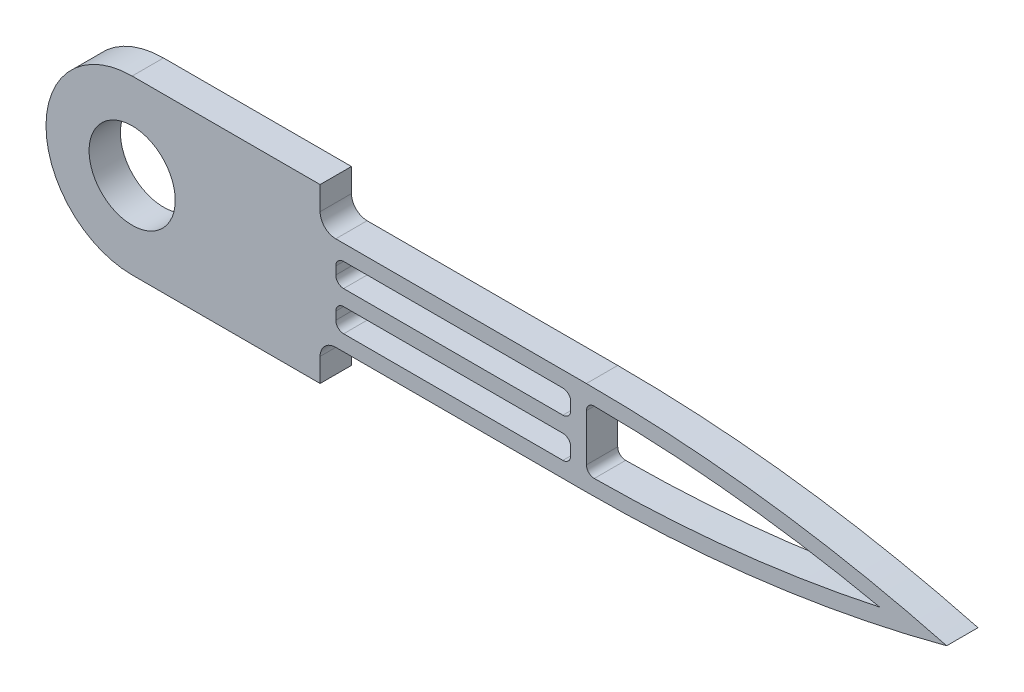
ISO-10303-21;
HEADER;
FILE_DESCRIPTION(('STEP AP214'),'2;1');
FILE_NAME('part.step','',(''),(''),'','','');
FILE_SCHEMA(('AUTOMOTIVE_DESIGN { 1 0 10303 214 1 1 1 1 }'));
ENDSEC;
DATA;
#1=APPLICATION_CONTEXT('core data for automotive mechanical design processes');
#2=APPLICATION_PROTOCOL_DEFINITION('international standard','automotive_design',2000,#1);
#3=PRODUCT_CONTEXT('',#1,'mechanical');
#4=PRODUCT('Part','Part','',(#3));
#5=PRODUCT_RELATED_PRODUCT_CATEGORY('part','',(#4));
#6=PRODUCT_DEFINITION_FORMATION('','',#4);
#7=PRODUCT_DEFINITION_CONTEXT('part definition',#1,'design');
#8=PRODUCT_DEFINITION('design','',#6,#7);
#9=PRODUCT_DEFINITION_SHAPE('','',#8);
#10=(LENGTH_UNIT() NAMED_UNIT(*) SI_UNIT(.MILLI.,.METRE.));
#11=(NAMED_UNIT(*) PLANE_ANGLE_UNIT() SI_UNIT($,.RADIAN.));
#12=(NAMED_UNIT(*) SI_UNIT($,.STERADIAN.) SOLID_ANGLE_UNIT());
#13=UNCERTAINTY_MEASURE_WITH_UNIT(LENGTH_MEASURE(1.E-05),#10,'distance_accuracy_value','');
#14=(GEOMETRIC_REPRESENTATION_CONTEXT(3) GLOBAL_UNCERTAINTY_ASSIGNED_CONTEXT((#13)) GLOBAL_UNIT_ASSIGNED_CONTEXT((#10,
#11,#12)) REPRESENTATION_CONTEXT('',''));
#15=CARTESIAN_POINT('',(0.,0.,0.));
#16=DIRECTION('',(0.,0.,1.));
#17=DIRECTION('',(1.,0.,0.));
#18=AXIS2_PLACEMENT_3D('',#15,#16,#17);
#19=CARTESIAN_POINT('',(73.66,220.133333333333,5.08));
#20=DIRECTION('',(0.,0.,-1.));
#21=DIRECTION('',(-1.,0.,0.));
#22=AXIS2_PLACEMENT_3D('',#19,#20,#21);
#23=CYLINDRICAL_SURFACE('',#22,227.753333333333);
#24=CARTESIAN_POINT('',(73.66,220.133333333333,0.));
#25=DIRECTION('',(0.,0.,1.));
#26=DIRECTION('',(1.,0.,0.));
#27=AXIS2_PLACEMENT_3D('',#24,#25,#26);
#28=CIRCLE('',#27,227.753333333333);
#29=CARTESIAN_POINT('',(73.66,-7.62,0.));
#30=VERTEX_POINT('',#29);
#31=CARTESIAN_POINT('',(132.08,0.,0.));
#32=VERTEX_POINT('',#31);
#33=EDGE_CURVE('E308',#30,#32,#28,.T.);
#34=ORIENTED_EDGE('',*,*,#33,.T.);
#35=DIRECTION('',(0.,0.,-1.));
#36=VECTOR('',#35,1.);
#37=CARTESIAN_POINT('',(132.08,0.,5.08));
#38=LINE('',#37,#36);
#39=CARTESIAN_POINT('',(132.08,0.,5.08));
#40=VERTEX_POINT('',#39);
#41=EDGE_CURVE('E370',#40,#32,#38,.T.);
#42=ORIENTED_EDGE('',*,*,#41,.F.);
#43=CARTESIAN_POINT('',(73.66,220.133333333333,5.08));
#44=DIRECTION('',(0.,0.,1.));
#45=DIRECTION('',(1.,0.,0.));
#46=AXIS2_PLACEMENT_3D('',#43,#44,#45);
#47=CIRCLE('',#46,227.753333333333);
#48=CARTESIAN_POINT('',(73.66,-7.62,5.08));
#49=VERTEX_POINT('',#48);
#50=EDGE_CURVE('E311',#49,#40,#47,.T.);
#51=ORIENTED_EDGE('',*,*,#50,.F.);
#52=DIRECTION('',(0.,0.,-1.));
#53=VECTOR('',#52,1.);
#54=CARTESIAN_POINT('',(73.66,-7.62,5.08));
#55=LINE('',#54,#53);
#56=EDGE_CURVE('E333',#49,#30,#55,.T.);
#57=ORIENTED_EDGE('',*,*,#56,.T.);
#58=EDGE_LOOP('',(#34,#42,#51,#57));
#59=FACE_BOUND('',#58,.T.);
#60=ADVANCED_FACE('F32',(#59),#23,.T.);
#61=CARTESIAN_POINT('',(73.66,-220.133333333333,5.08));
#62=DIRECTION('',(0.,0.,-1.));
#63=DIRECTION('',(-1.,0.,0.));
#64=AXIS2_PLACEMENT_3D('',#61,#62,#63);
#65=CYLINDRICAL_SURFACE('',#64,227.753333333333);
#66=CARTESIAN_POINT('',(73.66,-220.133333333333,0.));
#67=DIRECTION('',(0.,0.,1.));
#68=DIRECTION('',(-1.,0.,0.));
#69=AXIS2_PLACEMENT_3D('',#66,#67,#68);
#70=CIRCLE('',#69,227.753333333333);
#71=CARTESIAN_POINT('',(73.66,7.62000000000002,0.));
#72=VERTEX_POINT('',#71);
#73=EDGE_CURVE('E336',#32,#72,#70,.T.);
#74=ORIENTED_EDGE('',*,*,#73,.T.);
#75=DIRECTION('',(0.,0.,-1.));
#76=VECTOR('',#75,1.);
#77=CARTESIAN_POINT('',(73.66,7.62000000000002,5.08));
#78=LINE('',#77,#76);
#79=CARTESIAN_POINT('',(73.66,7.62000000000002,5.08));
#80=VERTEX_POINT('',#79);
#81=EDGE_CURVE('E367',#80,#72,#78,.T.);
#82=ORIENTED_EDGE('',*,*,#81,.F.);
#83=CARTESIAN_POINT('',(73.66,-220.133333333333,5.08));
#84=DIRECTION('',(0.,0.,1.));
#85=DIRECTION('',(-1.,0.,0.));
#86=AXIS2_PLACEMENT_3D('',#83,#84,#85);
#87=CIRCLE('',#86,227.753333333333);
#88=EDGE_CURVE('E314',#40,#80,#87,.T.);
#89=ORIENTED_EDGE('',*,*,#88,.F.);
#90=ORIENTED_EDGE('',*,*,#41,.T.);
#91=EDGE_LOOP('',(#74,#82,#89,#90));
#92=FACE_BOUND('',#91,.T.);
#93=ADVANCED_FACE('F523',(#92),#65,.T.);
#94=CARTESIAN_POINT('',(30.48,7.62,5.08));
#95=DIRECTION('',(0.,-1.,0.));
#96=DIRECTION('',(1.,0.,0.));
#97=AXIS2_PLACEMENT_3D('',#94,#95,#96);
#98=PLANE('',#97);
#99=DIRECTION('',(-1.,0.,0.));
#100=VECTOR('',#99,1.);
#101=CARTESIAN_POINT('',(30.48,7.62,0.));
#102=LINE('',#101,#100);
#103=CARTESIAN_POINT('',(33.02,7.62,0.));
#104=VERTEX_POINT('',#103);
#105=EDGE_CURVE('E338',#72,#104,#102,.T.);
#106=ORIENTED_EDGE('',*,*,#105,.T.);
#107=DIRECTION('',(0.,0.,-1.));
#108=VECTOR('',#107,1.);
#109=CARTESIAN_POINT('',(33.02,7.62,5.08));
#110=LINE('',#109,#108);
#111=CARTESIAN_POINT('',(33.02,7.62,5.08));
#112=VERTEX_POINT('',#111);
#113=EDGE_CURVE('E381',#104,#112,#110,.F.);
#114=ORIENTED_EDGE('',*,*,#113,.T.);
#115=DIRECTION('',(-1.,0.,0.));
#116=VECTOR('',#115,1.);
#117=CARTESIAN_POINT('',(30.48,7.62,5.08));
#118=LINE('',#117,#116);
#119=EDGE_CURVE('E317',#80,#112,#118,.T.);
#120=ORIENTED_EDGE('',*,*,#119,.F.);
#121=ORIENTED_EDGE('',*,*,#81,.T.);
#122=EDGE_LOOP('',(#106,#114,#120,#121));
#123=FACE_BOUND('',#122,.T.);
#124=ADVANCED_FACE('F529',(#123),#98,.F.);
#125=CARTESIAN_POINT('',(30.48,13.97,5.08));
#126=DIRECTION('',(-1.,0.,0.));
#127=DIRECTION('',(0.,0.,1.));
#128=AXIS2_PLACEMENT_3D('',#125,#126,#127);
#129=PLANE('',#128);
#130=DIRECTION('',(0.,1.,0.));
#131=VECTOR('',#130,1.);
#132=CARTESIAN_POINT('',(30.48,13.97,5.08));
#133=LINE('',#132,#131);
#134=CARTESIAN_POINT('',(30.48,10.16,5.08));
#135=VERTEX_POINT('',#134);
#136=CARTESIAN_POINT('',(30.48,13.97,5.08));
#137=VERTEX_POINT('',#136);
#138=EDGE_CURVE('E320',#135,#137,#133,.T.);
#139=ORIENTED_EDGE('',*,*,#138,.F.);
#140=DIRECTION('',(0.,0.,-1.));
#141=VECTOR('',#140,1.);
#142=CARTESIAN_POINT('',(30.48,10.16,0.));
#143=LINE('',#142,#141);
#144=CARTESIAN_POINT('',(30.48,10.16,0.));
#145=VERTEX_POINT('',#144);
#146=EDGE_CURVE('E378',#135,#145,#143,.T.);
#147=ORIENTED_EDGE('',*,*,#146,.T.);
#148=DIRECTION('',(0.,1.,0.));
#149=VECTOR('',#148,1.);
#150=CARTESIAN_POINT('',(30.48,13.97,0.));
#151=LINE('',#150,#149);
#152=CARTESIAN_POINT('',(30.48,13.97,0.));
#153=VERTEX_POINT('',#152);
#154=EDGE_CURVE('E341',#145,#153,#151,.T.);
#155=ORIENTED_EDGE('',*,*,#154,.T.);
#156=DIRECTION('',(0.,0.,-1.));
#157=VECTOR('',#156,1.);
#158=CARTESIAN_POINT('',(30.48,13.97,5.08));
#159=LINE('',#158,#157);
#160=EDGE_CURVE('E364',#137,#153,#159,.T.);
#161=ORIENTED_EDGE('',*,*,#160,.F.);
#162=EDGE_LOOP('',(#139,#147,#155,#161));
#163=FACE_BOUND('',#162,.T.);
#164=ADVANCED_FACE('F639',(#163),#129,.F.);
#165=CARTESIAN_POINT('',(0.,13.97,5.08));
#166=DIRECTION('',(0.,-1.,0.));
#167=DIRECTION('',(1.,0.,0.));
#168=AXIS2_PLACEMENT_3D('',#165,#166,#167);
#169=PLANE('',#168);
#170=DIRECTION('',(-1.,0.,0.));
#171=VECTOR('',#170,1.);
#172=CARTESIAN_POINT('',(0.,13.97,0.));
#173=LINE('',#172,#171);
#174=CARTESIAN_POINT('',(0.,13.97,0.));
#175=VERTEX_POINT('',#174);
#176=EDGE_CURVE('E343',#153,#175,#173,.T.);
#177=ORIENTED_EDGE('',*,*,#176,.T.);
#178=DIRECTION('',(0.,0.,-1.));
#179=VECTOR('',#178,1.);
#180=CARTESIAN_POINT('',(0.,13.97,5.08));
#181=LINE('',#180,#179);
#182=CARTESIAN_POINT('',(0.,13.97,5.08));
#183=VERTEX_POINT('',#182);
#184=EDGE_CURVE('E361',#183,#175,#181,.T.);
#185=ORIENTED_EDGE('',*,*,#184,.F.);
#186=DIRECTION('',(-1.,0.,0.));
#187=VECTOR('',#186,1.);
#188=CARTESIAN_POINT('',(0.,13.97,5.08));
#189=LINE('',#188,#187);
#190=EDGE_CURVE('E322',#137,#183,#189,.T.);
#191=ORIENTED_EDGE('',*,*,#190,.F.);
#192=ORIENTED_EDGE('',*,*,#160,.T.);
#193=EDGE_LOOP('',(#177,#185,#191,#192));
#194=FACE_BOUND('',#193,.T.);
#195=ADVANCED_FACE('F635',(#194),#169,.F.);
#196=CARTESIAN_POINT('',(0.,0.,5.08));
#197=DIRECTION('',(0.,0.,-1.));
#198=DIRECTION('',(-1.,0.,0.));
#199=AXIS2_PLACEMENT_3D('',#196,#197,#198);
#200=CYLINDRICAL_SURFACE('',#199,13.97);
#201=CARTESIAN_POINT('',(0.,0.,0.));
#202=DIRECTION('',(0.,0.,1.));
#203=DIRECTION('',(1.,0.,0.));
#204=AXIS2_PLACEMENT_3D('',#201,#202,#203);
#205=CIRCLE('',#204,13.97);
#206=CARTESIAN_POINT('',(0.,-13.97,0.));
#207=VERTEX_POINT('',#206);
#208=EDGE_CURVE('E345',#175,#207,#205,.T.);
#209=ORIENTED_EDGE('',*,*,#208,.T.);
#210=DIRECTION('',(0.,0.,-1.));
#211=VECTOR('',#210,1.);
#212=CARTESIAN_POINT('',(0.,-13.97,5.08));
#213=LINE('',#212,#211);
#214=CARTESIAN_POINT('',(0.,-13.97,5.08));
#215=VERTEX_POINT('',#214);
#216=EDGE_CURVE('E358',#215,#207,#213,.T.);
#217=ORIENTED_EDGE('',*,*,#216,.F.);
#218=CARTESIAN_POINT('',(0.,0.,5.08));
#219=DIRECTION('',(0.,0.,1.));
#220=DIRECTION('',(1.,0.,0.));
#221=AXIS2_PLACEMENT_3D('',#218,#219,#220);
#222=CIRCLE('',#221,13.97);
#223=EDGE_CURVE('E324',#183,#215,#222,.T.);
#224=ORIENTED_EDGE('',*,*,#223,.F.);
#225=ORIENTED_EDGE('',*,*,#184,.T.);
#226=EDGE_LOOP('',(#209,#217,#224,#225));
#227=FACE_BOUND('',#226,.T.);
#228=ADVANCED_FACE('F631',(#227),#200,.T.);
#229=CARTESIAN_POINT('',(0.,-13.97,5.08));
#230=DIRECTION('',(0.,1.,0.));
#231=DIRECTION('',(-1.,0.,0.));
#232=AXIS2_PLACEMENT_3D('',#229,#230,#231);
#233=PLANE('',#232);
#234=DIRECTION('',(1.,0.,0.));
#235=VECTOR('',#234,1.);
#236=CARTESIAN_POINT('',(0.,-13.97,0.));
#237=LINE('',#236,#235);
#238=CARTESIAN_POINT('',(30.48,-13.97,0.));
#239=VERTEX_POINT('',#238);
#240=EDGE_CURVE('E347',#207,#239,#237,.T.);
#241=ORIENTED_EDGE('',*,*,#240,.T.);
#242=DIRECTION('',(0.,0.,-1.));
#243=VECTOR('',#242,1.);
#244=CARTESIAN_POINT('',(30.48,-13.97,5.08));
#245=LINE('',#244,#243);
#246=CARTESIAN_POINT('',(30.48,-13.97,5.08));
#247=VERTEX_POINT('',#246);
#248=EDGE_CURVE('E355',#247,#239,#245,.T.);
#249=ORIENTED_EDGE('',*,*,#248,.F.);
#250=DIRECTION('',(1.,0.,0.));
#251=VECTOR('',#250,1.);
#252=CARTESIAN_POINT('',(0.,-13.97,5.08));
#253=LINE('',#252,#251);
#254=EDGE_CURVE('E326',#215,#247,#253,.T.);
#255=ORIENTED_EDGE('',*,*,#254,.F.);
#256=ORIENTED_EDGE('',*,*,#216,.T.);
#257=EDGE_LOOP('',(#241,#249,#255,#256));
#258=FACE_BOUND('',#257,.T.);
#259=ADVANCED_FACE('F627',(#258),#233,.F.);
#260=CARTESIAN_POINT('',(30.48,-13.97,5.08));
#261=DIRECTION('',(-1.,0.,0.));
#262=DIRECTION('',(0.,0.,1.));
#263=AXIS2_PLACEMENT_3D('',#260,#261,#262);
#264=PLANE('',#263);
#265=DIRECTION('',(0.,1.,0.));
#266=VECTOR('',#265,1.);
#267=CARTESIAN_POINT('',(30.48,-13.97,0.));
#268=LINE('',#267,#266);
#269=CARTESIAN_POINT('',(30.48,-10.16,0.));
#270=VERTEX_POINT('',#269);
#271=EDGE_CURVE('E349',#239,#270,#268,.T.);
#272=ORIENTED_EDGE('',*,*,#271,.T.);
#273=DIRECTION('',(0.,0.,-1.));
#274=VECTOR('',#273,1.);
#275=CARTESIAN_POINT('',(30.48,-10.16,5.08));
#276=LINE('',#275,#274);
#277=CARTESIAN_POINT('',(30.48,-10.16,5.08));
#278=VERTEX_POINT('',#277);
#279=EDGE_CURVE('E376',#270,#278,#276,.F.);
#280=ORIENTED_EDGE('',*,*,#279,.T.);
#281=DIRECTION('',(0.,1.,0.));
#282=VECTOR('',#281,1.);
#283=CARTESIAN_POINT('',(30.48,-13.97,5.08));
#284=LINE('',#283,#282);
#285=EDGE_CURVE('E328',#247,#278,#284,.T.);
#286=ORIENTED_EDGE('',*,*,#285,.F.);
#287=ORIENTED_EDGE('',*,*,#248,.T.);
#288=EDGE_LOOP('',(#272,#280,#286,#287));
#289=FACE_BOUND('',#288,.T.);
#290=ADVANCED_FACE('F623',(#289),#264,.F.);
#291=CARTESIAN_POINT('',(30.48,-7.62,5.08));
#292=DIRECTION('',(0.,1.,0.));
#293=DIRECTION('',(-1.,0.,0.));
#294=AXIS2_PLACEMENT_3D('',#291,#292,#293);
#295=PLANE('',#294);
#296=DIRECTION('',(1.,0.,0.));
#297=VECTOR('',#296,1.);
#298=CARTESIAN_POINT('',(30.48,-7.62,5.08));
#299=LINE('',#298,#297);
#300=CARTESIAN_POINT('',(33.02,-7.62,5.08));
#301=VERTEX_POINT('',#300);
#302=EDGE_CURVE('E331',#301,#49,#299,.T.);
#303=ORIENTED_EDGE('',*,*,#302,.F.);
#304=DIRECTION('',(0.,0.,-1.));
#305=VECTOR('',#304,1.);
#306=CARTESIAN_POINT('',(33.02,-7.62,0.));
#307=LINE('',#306,#305);
#308=CARTESIAN_POINT('',(33.02,-7.62,0.));
#309=VERTEX_POINT('',#308);
#310=EDGE_CURVE('E373',#301,#309,#307,.T.);
#311=ORIENTED_EDGE('',*,*,#310,.T.);
#312=DIRECTION('',(1.,0.,0.));
#313=VECTOR('',#312,1.);
#314=CARTESIAN_POINT('',(30.48,-7.62,0.));
#315=LINE('',#314,#313);
#316=EDGE_CURVE('E315',#309,#30,#315,.T.);
#317=ORIENTED_EDGE('',*,*,#316,.T.);
#318=ORIENTED_EDGE('',*,*,#56,.F.);
#319=EDGE_LOOP('',(#303,#311,#317,#318));
#320=FACE_BOUND('',#319,.T.);
#321=ADVANCED_FACE('F617',(#320),#295,.F.);
#322=CARTESIAN_POINT('',(73.66,220.133333333333,5.08));
#323=DIRECTION('',(0.,0.,1.));
#324=DIRECTION('',(1.,0.,0.));
#325=AXIS2_PLACEMENT_3D('',#322,#323,#324);
#326=PLANE('',#325);
#327=CARTESIAN_POINT('',(73.66,220.133333333333,5.08));
#328=DIRECTION('',(0.,0.,1.));
#329=DIRECTION('',(1.,0.,0.));
#330=AXIS2_PLACEMENT_3D('',#327,#328,#329);
#331=CIRCLE('',#330,225.213333333333);
#332=CARTESIAN_POINT('',(74.9372022684309,-5.07637841435449,5.08));
#333=VERTEX_POINT('',#332);
#334=CARTESIAN_POINT('',(121.224283518904,0.,5.08));
#335=VERTEX_POINT('',#334);
#336=EDGE_CURVE('E260',#333,#335,#331,.T.);
#337=ORIENTED_EDGE('',*,*,#336,.F.);
#338=CARTESIAN_POINT('',(74.9299999999999,-3.80639883682993,5.08));
#339=DIRECTION('',(0.,0.,1.));
#340=DIRECTION('',(1.,0.,0.));
#341=AXIS2_PLACEMENT_3D('',#338,#339,#340);
#342=CIRCLE('',#341,1.27);
#343=CARTESIAN_POINT('',(73.66,-3.80639883682993,5.08));
#344=VERTEX_POINT('',#343);
#345=EDGE_CURVE('E450',#333,#344,#342,.F.);
#346=ORIENTED_EDGE('',*,*,#345,.T.);
#347=DIRECTION('',(0.,-1.,0.));
#348=VECTOR('',#347,1.);
#349=CARTESIAN_POINT('',(73.66,-5.08,5.08));
#350=LINE('',#349,#348);
#351=CARTESIAN_POINT('',(73.66,3.80639883682993,5.08));
#352=VERTEX_POINT('',#351);
#353=EDGE_CURVE('E254',#352,#344,#350,.T.);
#354=ORIENTED_EDGE('',*,*,#353,.F.);
#355=CARTESIAN_POINT('',(74.9299999999999,3.80639883682993,5.08));
#356=DIRECTION('',(0.,0.,1.));
#357=DIRECTION('',(1.,0.,0.));
#358=AXIS2_PLACEMENT_3D('',#355,#356,#357);
#359=CIRCLE('',#358,1.27);
#360=CARTESIAN_POINT('',(74.9372022684309,5.07637841435449,5.08));
#361=VERTEX_POINT('',#360);
#362=EDGE_CURVE('E446',#352,#361,#359,.F.);
#363=ORIENTED_EDGE('',*,*,#362,.T.);
#364=CARTESIAN_POINT('',(73.66,-220.133333333333,5.08));
#365=DIRECTION('',(0.,0.,1.));
#366=DIRECTION('',(1.,0.,0.));
#367=AXIS2_PLACEMENT_3D('',#364,#365,#366);
#368=CIRCLE('',#367,225.213333333333);
#369=EDGE_CURVE('E275',#335,#361,#368,.T.);
#370=ORIENTED_EDGE('',*,*,#369,.F.);
#371=EDGE_LOOP('',(#337,#346,#354,#363,#370));
#372=FACE_BOUND('',#371,.T.);
#373=DIRECTION('',(1.,0.,0.));
#374=VECTOR('',#373,1.);
#375=CARTESIAN_POINT('',(33.02,1.27,5.08));
#376=LINE('',#375,#374);
#377=CARTESIAN_POINT('',(34.29,1.27,5.08));
#378=VERTEX_POINT('',#377);
#379=CARTESIAN_POINT('',(69.85,1.27,5.08));
#380=VERTEX_POINT('',#379);
#381=EDGE_CURVE('E264',#378,#380,#376,.T.);
#382=ORIENTED_EDGE('',*,*,#381,.F.);
#383=CARTESIAN_POINT('',(34.29,2.54,5.08));
#384=DIRECTION('',(0.,0.,1.));
#385=DIRECTION('',(1.,0.,0.));
#386=AXIS2_PLACEMENT_3D('',#383,#384,#385);
#387=CIRCLE('',#386,1.27);
#388=CARTESIAN_POINT('',(33.02,2.54,5.08));
#389=VERTEX_POINT('',#388);
#390=EDGE_CURVE('E40',#378,#389,#387,.F.);
#391=ORIENTED_EDGE('',*,*,#390,.T.);
#392=DIRECTION('',(0.,-1.,0.));
#393=VECTOR('',#392,1.);
#394=CARTESIAN_POINT('',(33.02,5.08,5.08));
#395=LINE('',#394,#393);
#396=CARTESIAN_POINT('',(33.02,3.81,5.08));
#397=VERTEX_POINT('',#396);
#398=EDGE_CURVE('E476',#397,#389,#395,.T.);
#399=ORIENTED_EDGE('',*,*,#398,.F.);
#400=CARTESIAN_POINT('',(34.29,3.81,5.08));
#401=DIRECTION('',(0.,0.,1.));
#402=DIRECTION('',(1.,0.,0.));
#403=AXIS2_PLACEMENT_3D('',#400,#401,#402);
#404=CIRCLE('',#403,1.27);
#405=CARTESIAN_POINT('',(34.29,5.08,5.08));
#406=VERTEX_POINT('',#405);
#407=EDGE_CURVE('E469',#397,#406,#404,.F.);
#408=ORIENTED_EDGE('',*,*,#407,.T.);
#409=DIRECTION('',(-1.,0.,0.));
#410=VECTOR('',#409,1.);
#411=CARTESIAN_POINT('',(71.12,5.08,5.08));
#412=LINE('',#411,#410);
#413=CARTESIAN_POINT('',(69.85,5.08,5.08));
#414=VERTEX_POINT('',#413);
#415=EDGE_CURVE('E483',#414,#406,#412,.T.);
#416=ORIENTED_EDGE('',*,*,#415,.F.);
#417=CARTESIAN_POINT('',(69.85,3.81,5.08));
#418=DIRECTION('',(0.,0.,1.));
#419=DIRECTION('',(1.,0.,0.));
#420=AXIS2_PLACEMENT_3D('',#417,#418,#419);
#421=CIRCLE('',#420,1.27);
#422=CARTESIAN_POINT('',(71.12,3.81,5.08));
#423=VERTEX_POINT('',#422);
#424=EDGE_CURVE('E461',#414,#423,#421,.F.);
#425=ORIENTED_EDGE('',*,*,#424,.T.);
#426=DIRECTION('',(0.,1.,0.));
#427=VECTOR('',#426,1.);
#428=CARTESIAN_POINT('',(71.12,1.27,5.08));
#429=LINE('',#428,#427);
#430=CARTESIAN_POINT('',(71.12,2.54,5.08));
#431=VERTEX_POINT('',#430);
#432=EDGE_CURVE('E501',#431,#423,#429,.T.);
#433=ORIENTED_EDGE('',*,*,#432,.F.);
#434=CARTESIAN_POINT('',(69.85,2.54,5.08));
#435=DIRECTION('',(0.,0.,1.));
#436=DIRECTION('',(1.,0.,0.));
#437=AXIS2_PLACEMENT_3D('',#434,#435,#436);
#438=CIRCLE('',#437,1.27);
#439=EDGE_CURVE('E465',#431,#380,#438,.F.);
#440=ORIENTED_EDGE('',*,*,#439,.T.);
#441=EDGE_LOOP('',(#382,#391,#399,#408,#416,#425,#433,#440));
#442=FACE_BOUND('',#441,.T.);
#443=DIRECTION('',(0.,1.,0.));
#444=VECTOR('',#443,1.);
#445=CARTESIAN_POINT('',(71.12,-1.27,5.08));
#446=LINE('',#445,#444);
#447=CARTESIAN_POINT('',(71.12,-3.81,5.08));
#448=VERTEX_POINT('',#447);
#449=CARTESIAN_POINT('',(71.12,-2.54,5.08));
#450=VERTEX_POINT('',#449);
#451=EDGE_CURVE('E293',#448,#450,#446,.T.);
#452=ORIENTED_EDGE('',*,*,#451,.F.);
#453=CARTESIAN_POINT('',(69.85,-3.81,5.08));
#454=DIRECTION('',(0.,0.,1.));
#455=DIRECTION('',(1.,0.,0.));
#456=AXIS2_PLACEMENT_3D('',#453,#454,#455);
#457=CIRCLE('',#456,1.27);
#458=CARTESIAN_POINT('',(69.85,-5.08,5.08));
#459=VERTEX_POINT('',#458);
#460=EDGE_CURVE('E457',#448,#459,#457,.F.);
#461=ORIENTED_EDGE('',*,*,#460,.T.);
#462=DIRECTION('',(1.,0.,0.));
#463=VECTOR('',#462,1.);
#464=CARTESIAN_POINT('',(33.02,-5.08,5.08));
#465=LINE('',#464,#463);
#466=CARTESIAN_POINT('',(34.29,-5.08,5.08));
#467=VERTEX_POINT('',#466);
#468=EDGE_CURVE('E283',#467,#459,#465,.T.);
#469=ORIENTED_EDGE('',*,*,#468,.F.);
#470=CARTESIAN_POINT('',(34.29,-3.81,5.08));
#471=DIRECTION('',(0.,0.,1.));
#472=DIRECTION('',(1.,0.,0.));
#473=AXIS2_PLACEMENT_3D('',#470,#471,#472);
#474=CIRCLE('',#473,1.27);
#475=CARTESIAN_POINT('',(33.02,-3.81,5.08));
#476=VERTEX_POINT('',#475);
#477=EDGE_CURVE('E453',#467,#476,#474,.F.);
#478=ORIENTED_EDGE('',*,*,#477,.T.);
#479=DIRECTION('',(0.,-1.,0.));
#480=VECTOR('',#479,1.);
#481=CARTESIAN_POINT('',(33.02,-5.08,5.08));
#482=LINE('',#481,#480);
#483=CARTESIAN_POINT('',(33.02,-2.54,5.08));
#484=VERTEX_POINT('',#483);
#485=EDGE_CURVE('E300',#484,#476,#482,.T.);
#486=ORIENTED_EDGE('',*,*,#485,.F.);
#487=CARTESIAN_POINT('',(34.29,-2.54,5.08));
#488=DIRECTION('',(0.,0.,1.));
#489=DIRECTION('',(1.,0.,0.));
#490=AXIS2_PLACEMENT_3D('',#487,#488,#489);
#491=CIRCLE('',#490,1.27);
#492=CARTESIAN_POINT('',(34.29,-1.27,5.08));
#493=VERTEX_POINT('',#492);
#494=EDGE_CURVE('E442',#484,#493,#491,.F.);
#495=ORIENTED_EDGE('',*,*,#494,.T.);
#496=DIRECTION('',(-1.,0.,0.));
#497=VECTOR('',#496,1.);
#498=CARTESIAN_POINT('',(33.02,-1.27,5.08));
#499=LINE('',#498,#497);
#500=CARTESIAN_POINT('',(69.85,-1.27,5.08));
#501=VERTEX_POINT('',#500);
#502=EDGE_CURVE('E296',#501,#493,#499,.T.);
#503=ORIENTED_EDGE('',*,*,#502,.F.);
#504=CARTESIAN_POINT('',(69.85,-2.54,5.08));
#505=DIRECTION('',(0.,0.,1.));
#506=DIRECTION('',(1.,0.,0.));
#507=AXIS2_PLACEMENT_3D('',#504,#505,#506);
#508=CIRCLE('',#507,1.27);
#509=EDGE_CURVE('E438',#501,#450,#508,.F.);
#510=ORIENTED_EDGE('',*,*,#509,.T.);
#511=EDGE_LOOP('',(#452,#461,#469,#478,#486,#495,#503,#510));
#512=FACE_BOUND('',#511,.T.);
#513=CARTESIAN_POINT('',(0.,0.,5.08));
#514=DIRECTION('',(0.,0.,1.));
#515=DIRECTION('',(1.,0.,0.));
#516=AXIS2_PLACEMENT_3D('',#513,#514,#515);
#517=CIRCLE('',#516,6.985);
#518=CARTESIAN_POINT('',(6.985,0.,5.08));
#519=VERTEX_POINT('',#518);
#520=EDGE_CURVE('E292',#519,#519,#517,.T.);
#521=ORIENTED_EDGE('',*,*,#520,.F.);
#522=EDGE_LOOP('',(#521));
#523=FACE_BOUND('',#522,.T.);
#524=ORIENTED_EDGE('',*,*,#50,.T.);
#525=ORIENTED_EDGE('',*,*,#88,.T.);
#526=ORIENTED_EDGE('',*,*,#119,.T.);
#527=CARTESIAN_POINT('',(33.02,10.16,5.08));
#528=DIRECTION('',(0.,0.,1.));
#529=DIRECTION('',(1.,0.,0.));
#530=AXIS2_PLACEMENT_3D('',#527,#528,#529);
#531=CIRCLE('',#530,2.54);
#532=EDGE_CURVE('E389',#112,#135,#531,.F.);
#533=ORIENTED_EDGE('',*,*,#532,.T.);
#534=ORIENTED_EDGE('',*,*,#138,.T.);
#535=ORIENTED_EDGE('',*,*,#190,.T.);
#536=ORIENTED_EDGE('',*,*,#223,.T.);
#537=ORIENTED_EDGE('',*,*,#254,.T.);
#538=ORIENTED_EDGE('',*,*,#285,.T.);
#539=CARTESIAN_POINT('',(33.02,-10.16,5.08));
#540=DIRECTION('',(0.,0.,1.));
#541=DIRECTION('',(1.,0.,0.));
#542=AXIS2_PLACEMENT_3D('',#539,#540,#541);
#543=CIRCLE('',#542,2.54);
#544=EDGE_CURVE('E385',#278,#301,#543,.F.);
#545=ORIENTED_EDGE('',*,*,#544,.T.);
#546=ORIENTED_EDGE('',*,*,#302,.T.);
#547=EDGE_LOOP('',(#524,#525,#526,#533,#534,#535,#536,#537,#538,#545,#546));
#548=FACE_BOUND('',#547,.T.);
#549=ADVANCED_FACE('F474',(#372,#442,#512,#523,#548),#326,.T.);
#550=CARTESIAN_POINT('',(73.66,220.133333333333,0.));
#551=DIRECTION('',(0.,0.,1.));
#552=DIRECTION('',(1.,0.,0.));
#553=AXIS2_PLACEMENT_3D('',#550,#551,#552);
#554=PLANE('',#553);
#555=CARTESIAN_POINT('',(73.66,-220.133333333333,0.));
#556=DIRECTION('',(0.,0.,1.));
#557=DIRECTION('',(1.,0.,0.));
#558=AXIS2_PLACEMENT_3D('',#555,#556,#557);
#559=CIRCLE('',#558,225.213333333333);
#560=CARTESIAN_POINT('',(121.224283518904,0.,0.));
#561=VERTEX_POINT('',#560);
#562=CARTESIAN_POINT('',(74.9372022684309,5.07637841435449,0.));
#563=VERTEX_POINT('',#562);
#564=EDGE_CURVE('E246',#561,#563,#559,.T.);
#565=ORIENTED_EDGE('',*,*,#564,.T.);
#566=CARTESIAN_POINT('',(74.9299999999999,3.80639883682993,0.));
#567=DIRECTION('',(0.,0.,1.));
#568=DIRECTION('',(1.,0.,0.));
#569=AXIS2_PLACEMENT_3D('',#566,#567,#568);
#570=CIRCLE('',#569,1.27);
#571=CARTESIAN_POINT('',(73.66,3.80639883682993,0.));
#572=VERTEX_POINT('',#571);
#573=EDGE_CURVE('E448',#563,#572,#570,.T.);
#574=ORIENTED_EDGE('',*,*,#573,.T.);
#575=DIRECTION('',(0.,-1.,0.));
#576=VECTOR('',#575,1.);
#577=CARTESIAN_POINT('',(73.66,-5.08,0.));
#578=LINE('',#577,#576);
#579=CARTESIAN_POINT('',(73.66,-3.80639883682993,0.));
#580=VERTEX_POINT('',#579);
#581=EDGE_CURVE('E265',#572,#580,#578,.T.);
#582=ORIENTED_EDGE('',*,*,#581,.T.);
#583=CARTESIAN_POINT('',(74.9299999999999,-3.80639883682993,0.));
#584=DIRECTION('',(0.,0.,1.));
#585=DIRECTION('',(1.,0.,0.));
#586=AXIS2_PLACEMENT_3D('',#583,#584,#585);
#587=CIRCLE('',#586,1.27);
#588=CARTESIAN_POINT('',(74.9372022684309,-5.07637841435449,0.));
#589=VERTEX_POINT('',#588);
#590=EDGE_CURVE('E250',#580,#589,#587,.T.);
#591=ORIENTED_EDGE('',*,*,#590,.T.);
#592=CARTESIAN_POINT('',(73.66,220.133333333333,0.));
#593=DIRECTION('',(0.,0.,1.));
#594=DIRECTION('',(1.,0.,0.));
#595=AXIS2_PLACEMENT_3D('',#592,#593,#594);
#596=CIRCLE('',#595,225.213333333333);
#597=EDGE_CURVE('E242',#589,#561,#596,.T.);
#598=ORIENTED_EDGE('',*,*,#597,.T.);
#599=EDGE_LOOP('',(#565,#574,#582,#591,#598));
#600=FACE_BOUND('',#599,.T.);
#601=DIRECTION('',(-1.,0.,0.));
#602=VECTOR('',#601,1.);
#603=CARTESIAN_POINT('',(71.12,5.08,0.));
#604=LINE('',#603,#602);
#605=CARTESIAN_POINT('',(69.85,5.08,0.));
#606=VERTEX_POINT('',#605);
#607=CARTESIAN_POINT('',(34.29,5.08,0.));
#608=VERTEX_POINT('',#607);
#609=EDGE_CURVE('E495',#606,#608,#604,.T.);
#610=ORIENTED_EDGE('',*,*,#609,.T.);
#611=CARTESIAN_POINT('',(34.29,3.81,0.));
#612=DIRECTION('',(0.,0.,1.));
#613=DIRECTION('',(1.,0.,0.));
#614=AXIS2_PLACEMENT_3D('',#611,#612,#613);
#615=CIRCLE('',#614,1.27);
#616=CARTESIAN_POINT('',(33.02,3.81,0.));
#617=VERTEX_POINT('',#616);
#618=EDGE_CURVE('E54',#608,#617,#615,.T.);
#619=ORIENTED_EDGE('',*,*,#618,.T.);
#620=DIRECTION('',(0.,-1.,0.));
#621=VECTOR('',#620,1.);
#622=CARTESIAN_POINT('',(33.02,5.08,0.));
#623=LINE('',#622,#621);
#624=CARTESIAN_POINT('',(33.02,2.54,0.));
#625=VERTEX_POINT('',#624);
#626=EDGE_CURVE('E297',#617,#625,#623,.T.);
#627=ORIENTED_EDGE('',*,*,#626,.T.);
#628=CARTESIAN_POINT('',(34.29,2.54,0.));
#629=DIRECTION('',(0.,0.,1.));
#630=DIRECTION('',(1.,0.,0.));
#631=AXIS2_PLACEMENT_3D('',#628,#629,#630);
#632=CIRCLE('',#631,1.27);
#633=CARTESIAN_POINT('',(34.29,1.27,0.));
#634=VERTEX_POINT('',#633);
#635=EDGE_CURVE('E11',#625,#634,#632,.T.);
#636=ORIENTED_EDGE('',*,*,#635,.T.);
#637=DIRECTION('',(1.,0.,0.));
#638=VECTOR('',#637,1.);
#639=CARTESIAN_POINT('',(33.02,1.27,0.));
#640=LINE('',#639,#638);
#641=CARTESIAN_POINT('',(69.85,1.27,0.));
#642=VERTEX_POINT('',#641);
#643=EDGE_CURVE('E482',#634,#642,#640,.T.);
#644=ORIENTED_EDGE('',*,*,#643,.T.);
#645=CARTESIAN_POINT('',(69.85,2.54,0.));
#646=DIRECTION('',(0.,0.,1.));
#647=DIRECTION('',(1.,0.,0.));
#648=AXIS2_PLACEMENT_3D('',#645,#646,#647);
#649=CIRCLE('',#648,1.27);
#650=CARTESIAN_POINT('',(71.12,2.54,0.));
#651=VERTEX_POINT('',#650);
#652=EDGE_CURVE('E467',#642,#651,#649,.T.);
#653=ORIENTED_EDGE('',*,*,#652,.T.);
#654=DIRECTION('',(0.,1.,0.));
#655=VECTOR('',#654,1.);
#656=CARTESIAN_POINT('',(71.12,1.27,0.));
#657=LINE('',#656,#655);
#658=CARTESIAN_POINT('',(71.12,3.81,0.));
#659=VERTEX_POINT('',#658);
#660=EDGE_CURVE('E492',#651,#659,#657,.T.);
#661=ORIENTED_EDGE('',*,*,#660,.T.);
#662=CARTESIAN_POINT('',(69.85,3.81,0.));
#663=DIRECTION('',(0.,0.,1.));
#664=DIRECTION('',(1.,0.,0.));
#665=AXIS2_PLACEMENT_3D('',#662,#663,#664);
#666=CIRCLE('',#665,1.27);
#667=EDGE_CURVE('E463',#659,#606,#666,.T.);
#668=ORIENTED_EDGE('',*,*,#667,.T.);
#669=EDGE_LOOP('',(#610,#619,#627,#636,#644,#653,#661,#668));
#670=FACE_BOUND('',#669,.T.);
#671=DIRECTION('',(0.,-1.,0.));
#672=VECTOR('',#671,1.);
#673=CARTESIAN_POINT('',(33.02,-5.08,0.));
#674=LINE('',#673,#672);
#675=CARTESIAN_POINT('',(33.02,-2.54,0.));
#676=VERTEX_POINT('',#675);
#677=CARTESIAN_POINT('',(33.02,-3.81,0.));
#678=VERTEX_POINT('',#677);
#679=EDGE_CURVE('E286',#676,#678,#674,.T.);
#680=ORIENTED_EDGE('',*,*,#679,.T.);
#681=CARTESIAN_POINT('',(34.29,-3.81,0.));
#682=DIRECTION('',(0.,0.,1.));
#683=DIRECTION('',(1.,0.,0.));
#684=AXIS2_PLACEMENT_3D('',#681,#682,#683);
#685=CIRCLE('',#684,1.27);
#686=CARTESIAN_POINT('',(34.29,-5.08,0.));
#687=VERTEX_POINT('',#686);
#688=EDGE_CURVE('E455',#678,#687,#685,.T.);
#689=ORIENTED_EDGE('',*,*,#688,.T.);
#690=DIRECTION('',(1.,0.,0.));
#691=VECTOR('',#690,1.);
#692=CARTESIAN_POINT('',(33.02,-5.08,0.));
#693=LINE('',#692,#691);
#694=CARTESIAN_POINT('',(69.85,-5.08,0.));
#695=VERTEX_POINT('',#694);
#696=EDGE_CURVE('E289',#687,#695,#693,.T.);
#697=ORIENTED_EDGE('',*,*,#696,.T.);
#698=CARTESIAN_POINT('',(69.85,-3.81,0.));
#699=DIRECTION('',(0.,0.,1.));
#700=DIRECTION('',(1.,0.,0.));
#701=AXIS2_PLACEMENT_3D('',#698,#699,#700);
#702=CIRCLE('',#701,1.27);
#703=CARTESIAN_POINT('',(71.12,-3.81,0.));
#704=VERTEX_POINT('',#703);
#705=EDGE_CURVE('E459',#695,#704,#702,.T.);
#706=ORIENTED_EDGE('',*,*,#705,.T.);
#707=DIRECTION('',(0.,1.,0.));
#708=VECTOR('',#707,1.);
#709=CARTESIAN_POINT('',(71.12,-1.27,0.));
#710=LINE('',#709,#708);
#711=CARTESIAN_POINT('',(71.12,-2.54,0.));
#712=VERTEX_POINT('',#711);
#713=EDGE_CURVE('E279',#704,#712,#710,.T.);
#714=ORIENTED_EDGE('',*,*,#713,.T.);
#715=CARTESIAN_POINT('',(69.85,-2.54,0.));
#716=DIRECTION('',(0.,0.,1.));
#717=DIRECTION('',(1.,0.,0.));
#718=AXIS2_PLACEMENT_3D('',#715,#716,#717);
#719=CIRCLE('',#718,1.27);
#720=CARTESIAN_POINT('',(69.85,-1.27,0.));
#721=VERTEX_POINT('',#720);
#722=EDGE_CURVE('E440',#712,#721,#719,.T.);
#723=ORIENTED_EDGE('',*,*,#722,.T.);
#724=DIRECTION('',(-1.,0.,0.));
#725=VECTOR('',#724,1.);
#726=CARTESIAN_POINT('',(33.02,-1.27,0.));
#727=LINE('',#726,#725);
#728=CARTESIAN_POINT('',(34.29,-1.27,0.));
#729=VERTEX_POINT('',#728);
#730=EDGE_CURVE('E282',#721,#729,#727,.T.);
#731=ORIENTED_EDGE('',*,*,#730,.T.);
#732=CARTESIAN_POINT('',(34.29,-2.54,0.));
#733=DIRECTION('',(0.,0.,1.));
#734=DIRECTION('',(1.,0.,0.));
#735=AXIS2_PLACEMENT_3D('',#732,#733,#734);
#736=CIRCLE('',#735,1.27);
#737=EDGE_CURVE('E444',#729,#676,#736,.T.);
#738=ORIENTED_EDGE('',*,*,#737,.T.);
#739=EDGE_LOOP('',(#680,#689,#697,#706,#714,#723,#731,#738));
#740=FACE_BOUND('',#739,.T.);
#741=CARTESIAN_POINT('',(0.,0.,0.));
#742=DIRECTION('',(0.,0.,1.));
#743=DIRECTION('',(1.,0.,0.));
#744=AXIS2_PLACEMENT_3D('',#741,#742,#743);
#745=CIRCLE('',#744,6.985);
#746=CARTESIAN_POINT('',(6.985,0.,0.));
#747=VERTEX_POINT('',#746);
#748=EDGE_CURVE('E305',#747,#747,#745,.T.);
#749=ORIENTED_EDGE('',*,*,#748,.T.);
#750=EDGE_LOOP('',(#749));
#751=FACE_BOUND('',#750,.T.);
#752=ORIENTED_EDGE('',*,*,#33,.F.);
#753=ORIENTED_EDGE('',*,*,#316,.F.);
#754=CARTESIAN_POINT('',(33.02,-10.16,0.));
#755=DIRECTION('',(0.,0.,1.));
#756=DIRECTION('',(1.,0.,0.));
#757=AXIS2_PLACEMENT_3D('',#754,#755,#756);
#758=CIRCLE('',#757,2.54);
#759=EDGE_CURVE('E383',#309,#270,#758,.T.);
#760=ORIENTED_EDGE('',*,*,#759,.T.);
#761=ORIENTED_EDGE('',*,*,#271,.F.);
#762=ORIENTED_EDGE('',*,*,#240,.F.);
#763=ORIENTED_EDGE('',*,*,#208,.F.);
#764=ORIENTED_EDGE('',*,*,#176,.F.);
#765=ORIENTED_EDGE('',*,*,#154,.F.);
#766=CARTESIAN_POINT('',(33.02,10.16,0.));
#767=DIRECTION('',(0.,0.,1.));
#768=DIRECTION('',(1.,0.,0.));
#769=AXIS2_PLACEMENT_3D('',#766,#767,#768);
#770=CIRCLE('',#769,2.54);
#771=EDGE_CURVE('E387',#145,#104,#770,.T.);
#772=ORIENTED_EDGE('',*,*,#771,.T.);
#773=ORIENTED_EDGE('',*,*,#105,.F.);
#774=ORIENTED_EDGE('',*,*,#73,.F.);
#775=EDGE_LOOP('',(#752,#753,#760,#761,#762,#763,#764,#765,#772,#773,#774));
#776=FACE_BOUND('',#775,.T.);
#777=ADVANCED_FACE('F244',(#600,#670,#740,#751,#776),#554,.F.);
#778=CARTESIAN_POINT('',(0.,0.,0.));
#779=DIRECTION('',(0.,0.,1.));
#780=DIRECTION('',(1.,0.,0.));
#781=AXIS2_PLACEMENT_3D('',#778,#779,#780);
#782=CYLINDRICAL_SURFACE('',#781,6.985);
#783=ORIENTED_EDGE('',*,*,#748,.F.);
#784=EDGE_LOOP('',(#783));
#785=FACE_BOUND('',#784,.T.);
#786=ORIENTED_EDGE('',*,*,#520,.T.);
#787=EDGE_LOOP('',(#786));
#788=FACE_BOUND('',#787,.T.);
#789=ADVANCED_FACE('F538',(#785,#788),#782,.F.);
#790=CARTESIAN_POINT('',(33.02,-10.16,5.08));
#791=DIRECTION('',(0.,0.,1.));
#792=DIRECTION('',(1.,0.,0.));
#793=AXIS2_PLACEMENT_3D('',#790,#791,#792);
#794=CYLINDRICAL_SURFACE('',#793,2.54);
#795=ORIENTED_EDGE('',*,*,#544,.F.);
#796=ORIENTED_EDGE('',*,*,#279,.F.);
#797=ORIENTED_EDGE('',*,*,#759,.F.);
#798=ORIENTED_EDGE('',*,*,#310,.F.);
#799=EDGE_LOOP('',(#795,#796,#797,#798));
#800=FACE_BOUND('',#799,.T.);
#801=ADVANCED_FACE('F534',(#800),#794,.F.);
#802=CARTESIAN_POINT('',(33.02,10.16,5.08));
#803=DIRECTION('',(0.,0.,1.));
#804=DIRECTION('',(1.,0.,0.));
#805=AXIS2_PLACEMENT_3D('',#802,#803,#804);
#806=CYLINDRICAL_SURFACE('',#805,2.54);
#807=ORIENTED_EDGE('',*,*,#532,.F.);
#808=ORIENTED_EDGE('',*,*,#113,.F.);
#809=ORIENTED_EDGE('',*,*,#771,.F.);
#810=ORIENTED_EDGE('',*,*,#146,.F.);
#811=EDGE_LOOP('',(#807,#808,#809,#810));
#812=FACE_BOUND('',#811,.T.);
#813=ADVANCED_FACE('F537',(#812),#806,.F.);
#814=CARTESIAN_POINT('',(71.12,-1.27,0.));
#815=DIRECTION('',(1.,0.,0.));
#816=DIRECTION('',(0.,0.,-1.));
#817=AXIS2_PLACEMENT_3D('',#814,#815,#816);
#818=PLANE('',#817);
#819=ORIENTED_EDGE('',*,*,#451,.T.);
#820=DIRECTION('',(0.,0.,1.));
#821=VECTOR('',#820,1.);
#822=CARTESIAN_POINT('',(71.12,-2.54,0.));
#823=LINE('',#822,#821);
#824=EDGE_CURVE('E399',#450,#712,#823,.F.);
#825=ORIENTED_EDGE('',*,*,#824,.T.);
#826=ORIENTED_EDGE('',*,*,#713,.F.);
#827=DIRECTION('',(0.,0.,1.));
#828=VECTOR('',#827,1.);
#829=CARTESIAN_POINT('',(71.12,-3.81,5.08));
#830=LINE('',#829,#828);
#831=EDGE_CURVE('E396',#704,#448,#830,.T.);
#832=ORIENTED_EDGE('',*,*,#831,.T.);
#833=EDGE_LOOP('',(#819,#825,#826,#832));
#834=FACE_BOUND('',#833,.T.);
#835=ADVANCED_FACE('F542',(#834),#818,.F.);
#836=CARTESIAN_POINT('',(33.02,-5.08,0.));
#837=DIRECTION('',(0.,-1.,0.));
#838=DIRECTION('',(1.,0.,0.));
#839=AXIS2_PLACEMENT_3D('',#836,#837,#838);
#840=PLANE('',#839);
#841=ORIENTED_EDGE('',*,*,#696,.F.);
#842=DIRECTION('',(0.,0.,1.));
#843=VECTOR('',#842,1.);
#844=CARTESIAN_POINT('',(34.29,-5.08,5.08));
#845=LINE('',#844,#843);
#846=EDGE_CURVE('E416',#687,#467,#845,.T.);
#847=ORIENTED_EDGE('',*,*,#846,.T.);
#848=ORIENTED_EDGE('',*,*,#468,.T.);
#849=DIRECTION('',(0.,0.,1.));
#850=VECTOR('',#849,1.);
#851=CARTESIAN_POINT('',(69.85,-5.08,0.));
#852=LINE('',#851,#850);
#853=EDGE_CURVE('E414',#459,#695,#852,.F.);
#854=ORIENTED_EDGE('',*,*,#853,.T.);
#855=EDGE_LOOP('',(#841,#847,#848,#854));
#856=FACE_BOUND('',#855,.T.);
#857=ADVANCED_FACE('F598',(#856),#840,.F.);
#858=CARTESIAN_POINT('',(33.02,-5.08,0.));
#859=DIRECTION('',(-1.,0.,0.));
#860=DIRECTION('',(0.,0.,1.));
#861=AXIS2_PLACEMENT_3D('',#858,#859,#860);
#862=PLANE('',#861);
#863=ORIENTED_EDGE('',*,*,#679,.F.);
#864=DIRECTION('',(0.,0.,1.));
#865=VECTOR('',#864,1.);
#866=CARTESIAN_POINT('',(33.02,-2.54,5.08));
#867=LINE('',#866,#865);
#868=EDGE_CURVE('E403',#676,#484,#867,.T.);
#869=ORIENTED_EDGE('',*,*,#868,.T.);
#870=ORIENTED_EDGE('',*,*,#485,.T.);
#871=DIRECTION('',(0.,0.,1.));
#872=VECTOR('',#871,1.);
#873=CARTESIAN_POINT('',(33.02,-3.81,0.));
#874=LINE('',#873,#872);
#875=EDGE_CURVE('E401',#476,#678,#874,.F.);
#876=ORIENTED_EDGE('',*,*,#875,.T.);
#877=EDGE_LOOP('',(#863,#869,#870,#876));
#878=FACE_BOUND('',#877,.T.);
#879=ADVANCED_FACE('F601',(#878),#862,.F.);
#880=CARTESIAN_POINT('',(33.02,-1.27,0.));
#881=DIRECTION('',(0.,1.,0.));
#882=DIRECTION('',(-1.,0.,0.));
#883=AXIS2_PLACEMENT_3D('',#880,#881,#882);
#884=PLANE('',#883);
#885=ORIENTED_EDGE('',*,*,#730,.F.);
#886=DIRECTION('',(0.,0.,1.));
#887=VECTOR('',#886,1.);
#888=CARTESIAN_POINT('',(69.85,-1.27,5.08));
#889=LINE('',#888,#887);
#890=EDGE_CURVE('E393',#721,#501,#889,.T.);
#891=ORIENTED_EDGE('',*,*,#890,.T.);
#892=ORIENTED_EDGE('',*,*,#502,.T.);
#893=DIRECTION('',(0.,0.,1.));
#894=VECTOR('',#893,1.);
#895=CARTESIAN_POINT('',(34.29,-1.27,0.));
#896=LINE('',#895,#894);
#897=EDGE_CURVE('E391',#493,#729,#896,.F.);
#898=ORIENTED_EDGE('',*,*,#897,.T.);
#899=EDGE_LOOP('',(#885,#891,#892,#898));
#900=FACE_BOUND('',#899,.T.);
#901=ADVANCED_FACE('F592',(#900),#884,.F.);
#902=CARTESIAN_POINT('',(33.02,1.27,0.));
#903=DIRECTION('',(0.,-1.,0.));
#904=DIRECTION('',(1.,0.,0.));
#905=AXIS2_PLACEMENT_3D('',#902,#903,#904);
#906=PLANE('',#905);
#907=ORIENTED_EDGE('',*,*,#381,.T.);
#908=DIRECTION('',(0.,0.,1.));
#909=VECTOR('',#908,1.);
#910=CARTESIAN_POINT('',(69.85,1.27,0.));
#911=LINE('',#910,#909);
#912=EDGE_CURVE('E432',#380,#642,#911,.F.);
#913=ORIENTED_EDGE('',*,*,#912,.T.);
#914=ORIENTED_EDGE('',*,*,#643,.F.);
#915=DIRECTION('',(0.,0.,1.));
#916=VECTOR('',#915,1.);
#917=CARTESIAN_POINT('',(34.29,1.27,5.08));
#918=LINE('',#917,#916);
#919=EDGE_CURVE('E429',#634,#378,#918,.T.);
#920=ORIENTED_EDGE('',*,*,#919,.T.);
#921=EDGE_LOOP('',(#907,#913,#914,#920));
#922=FACE_BOUND('',#921,.T.);
#923=ADVANCED_FACE('F490',(#922),#906,.F.);
#924=CARTESIAN_POINT('',(33.02,5.08,0.));
#925=DIRECTION('',(-1.,0.,0.));
#926=DIRECTION('',(0.,0.,1.));
#927=AXIS2_PLACEMENT_3D('',#924,#925,#926);
#928=PLANE('',#927);
#929=ORIENTED_EDGE('',*,*,#626,.F.);
#930=DIRECTION('',(0.,0.,1.));
#931=VECTOR('',#930,1.);
#932=CARTESIAN_POINT('',(33.02,3.81,5.08));
#933=LINE('',#932,#931);
#934=EDGE_CURVE('E435',#617,#397,#933,.T.);
#935=ORIENTED_EDGE('',*,*,#934,.T.);
#936=ORIENTED_EDGE('',*,*,#398,.T.);
#937=DIRECTION('',(0.,0.,1.));
#938=VECTOR('',#937,1.);
#939=CARTESIAN_POINT('',(33.02,2.54,0.));
#940=LINE('',#939,#938);
#941=EDGE_CURVE('E47',#389,#625,#940,.F.);
#942=ORIENTED_EDGE('',*,*,#941,.T.);
#943=EDGE_LOOP('',(#929,#935,#936,#942));
#944=FACE_BOUND('',#943,.T.);
#945=ADVANCED_FACE('F480',(#944),#928,.F.);
#946=CARTESIAN_POINT('',(71.12,5.08,0.));
#947=DIRECTION('',(0.,1.,0.));
#948=DIRECTION('',(-1.,0.,0.));
#949=AXIS2_PLACEMENT_3D('',#946,#947,#948);
#950=PLANE('',#949);
#951=ORIENTED_EDGE('',*,*,#609,.F.);
#952=DIRECTION('',(0.,0.,1.));
#953=VECTOR('',#952,1.);
#954=CARTESIAN_POINT('',(69.85,5.08,5.08));
#955=LINE('',#954,#953);
#956=EDGE_CURVE('E421',#606,#414,#955,.T.);
#957=ORIENTED_EDGE('',*,*,#956,.T.);
#958=ORIENTED_EDGE('',*,*,#415,.T.);
#959=DIRECTION('',(0.,0.,1.));
#960=VECTOR('',#959,1.);
#961=CARTESIAN_POINT('',(34.29,5.08,0.));
#962=LINE('',#961,#960);
#963=EDGE_CURVE('E419',#406,#608,#962,.F.);
#964=ORIENTED_EDGE('',*,*,#963,.T.);
#965=EDGE_LOOP('',(#951,#957,#958,#964));
#966=FACE_BOUND('',#965,.T.);
#967=ADVANCED_FACE('F509',(#966),#950,.F.);
#968=CARTESIAN_POINT('',(71.12,1.27,0.));
#969=DIRECTION('',(1.,0.,0.));
#970=DIRECTION('',(0.,0.,-1.));
#971=AXIS2_PLACEMENT_3D('',#968,#969,#970);
#972=PLANE('',#971);
#973=ORIENTED_EDGE('',*,*,#432,.T.);
#974=DIRECTION('',(0.,0.,1.));
#975=VECTOR('',#974,1.);
#976=CARTESIAN_POINT('',(71.12,3.81,0.));
#977=LINE('',#976,#975);
#978=EDGE_CURVE('E427',#423,#659,#977,.F.);
#979=ORIENTED_EDGE('',*,*,#978,.T.);
#980=ORIENTED_EDGE('',*,*,#660,.F.);
#981=DIRECTION('',(0.,0.,1.));
#982=VECTOR('',#981,1.);
#983=CARTESIAN_POINT('',(71.12,2.54,5.08));
#984=LINE('',#983,#982);
#985=EDGE_CURVE('E424',#651,#431,#984,.T.);
#986=ORIENTED_EDGE('',*,*,#985,.T.);
#987=EDGE_LOOP('',(#973,#979,#980,#986));
#988=FACE_BOUND('',#987,.T.);
#989=ADVANCED_FACE('F577',(#988),#972,.F.);
#990=CARTESIAN_POINT('',(73.66,220.133333333333,0.));
#991=DIRECTION('',(0.,0.,1.));
#992=DIRECTION('',(1.,0.,0.));
#993=AXIS2_PLACEMENT_3D('',#990,#991,#992);
#994=CYLINDRICAL_SURFACE('',#993,225.213333333333);
#995=ORIENTED_EDGE('',*,*,#597,.F.);
#996=DIRECTION('',(0.,0.,1.));
#997=VECTOR('',#996,1.);
#998=CARTESIAN_POINT('',(74.9372022684309,-5.07637841435449,0.));
#999=LINE('',#998,#997);
#1000=EDGE_CURVE('E412',#589,#333,#999,.T.);
#1001=ORIENTED_EDGE('',*,*,#1000,.T.);
#1002=ORIENTED_EDGE('',*,*,#336,.T.);
#1003=DIRECTION('',(0.,0.,1.));
#1004=VECTOR('',#1003,1.);
#1005=CARTESIAN_POINT('',(121.224283518904,0.,0.));
#1006=LINE('',#1005,#1004);
#1007=EDGE_CURVE('E257',#561,#335,#1006,.T.);
#1008=ORIENTED_EDGE('',*,*,#1007,.F.);
#1009=EDGE_LOOP('',(#995,#1001,#1002,#1008));
#1010=FACE_BOUND('',#1009,.T.);
#1011=ADVANCED_FACE('F258',(#1010),#994,.F.);
#1012=CARTESIAN_POINT('',(73.66,-5.08,0.));
#1013=DIRECTION('',(-1.,0.,0.));
#1014=DIRECTION('',(0.,0.,1.));
#1015=AXIS2_PLACEMENT_3D('',#1012,#1013,#1014);
#1016=PLANE('',#1015);
#1017=ORIENTED_EDGE('',*,*,#581,.F.);
#1018=DIRECTION('',(0.,0.,-1.));
#1019=VECTOR('',#1018,1.);
#1020=CARTESIAN_POINT('',(73.66,3.80639883682993,5.08));
#1021=LINE('',#1020,#1019);
#1022=EDGE_CURVE('E408',#572,#352,#1021,.F.);
#1023=ORIENTED_EDGE('',*,*,#1022,.T.);
#1024=ORIENTED_EDGE('',*,*,#353,.T.);
#1025=DIRECTION('',(0.,0.,-1.));
#1026=VECTOR('',#1025,1.);
#1027=CARTESIAN_POINT('',(73.66,-3.80639883682993,0.));
#1028=LINE('',#1027,#1026);
#1029=EDGE_CURVE('E406',#344,#580,#1028,.T.);
#1030=ORIENTED_EDGE('',*,*,#1029,.T.);
#1031=EDGE_LOOP('',(#1017,#1023,#1024,#1030));
#1032=FACE_BOUND('',#1031,.T.);
#1033=ADVANCED_FACE('F585',(#1032),#1016,.F.);
#1034=CARTESIAN_POINT('',(73.66,-220.133333333333,0.));
#1035=DIRECTION('',(0.,0.,1.));
#1036=DIRECTION('',(1.,0.,0.));
#1037=AXIS2_PLACEMENT_3D('',#1034,#1035,#1036);
#1038=CYLINDRICAL_SURFACE('',#1037,225.213333333333);
#1039=ORIENTED_EDGE('',*,*,#369,.T.);
#1040=DIRECTION('',(0.,0.,1.));
#1041=VECTOR('',#1040,1.);
#1042=CARTESIAN_POINT('',(74.9372022684309,5.07637841435449,0.));
#1043=LINE('',#1042,#1041);
#1044=EDGE_CURVE('E269',#361,#563,#1043,.F.);
#1045=ORIENTED_EDGE('',*,*,#1044,.T.);
#1046=ORIENTED_EDGE('',*,*,#564,.F.);
#1047=ORIENTED_EDGE('',*,*,#1007,.T.);
#1048=EDGE_LOOP('',(#1039,#1045,#1046,#1047));
#1049=FACE_BOUND('',#1048,.T.);
#1050=ADVANCED_FACE('F267',(#1049),#1038,.F.);
#1051=CARTESIAN_POINT('',(69.85,-2.54,0.));
#1052=DIRECTION('',(0.,0.,-1.));
#1053=DIRECTION('',(-1.,0.,0.));
#1054=AXIS2_PLACEMENT_3D('',#1051,#1052,#1053);
#1055=CYLINDRICAL_SURFACE('',#1054,1.27);
#1056=ORIENTED_EDGE('',*,*,#722,.F.);
#1057=ORIENTED_EDGE('',*,*,#824,.F.);
#1058=ORIENTED_EDGE('',*,*,#509,.F.);
#1059=ORIENTED_EDGE('',*,*,#890,.F.);
#1060=EDGE_LOOP('',(#1056,#1057,#1058,#1059));
#1061=FACE_BOUND('',#1060,.T.);
#1062=ADVANCED_FACE('F544',(#1061),#1055,.F.);
#1063=CARTESIAN_POINT('',(34.29,-2.54,0.));
#1064=DIRECTION('',(0.,0.,-1.));
#1065=DIRECTION('',(-1.,0.,0.));
#1066=AXIS2_PLACEMENT_3D('',#1063,#1064,#1065);
#1067=CYLINDRICAL_SURFACE('',#1066,1.27);
#1068=ORIENTED_EDGE('',*,*,#737,.F.);
#1069=ORIENTED_EDGE('',*,*,#897,.F.);
#1070=ORIENTED_EDGE('',*,*,#494,.F.);
#1071=ORIENTED_EDGE('',*,*,#868,.F.);
#1072=EDGE_LOOP('',(#1068,#1069,#1070,#1071));
#1073=FACE_BOUND('',#1072,.T.);
#1074=ADVANCED_FACE('F547',(#1073),#1067,.F.);
#1075=CARTESIAN_POINT('',(74.9299999999999,3.80639883682993,0.));
#1076=DIRECTION('',(0.,0.,1.));
#1077=DIRECTION('',(1.,0.,0.));
#1078=AXIS2_PLACEMENT_3D('',#1075,#1076,#1077);
#1079=CYLINDRICAL_SURFACE('',#1078,1.27);
#1080=ORIENTED_EDGE('',*,*,#573,.F.);
#1081=ORIENTED_EDGE('',*,*,#1044,.F.);
#1082=ORIENTED_EDGE('',*,*,#362,.F.);
#1083=ORIENTED_EDGE('',*,*,#1022,.F.);
#1084=EDGE_LOOP('',(#1080,#1081,#1082,#1083));
#1085=FACE_BOUND('',#1084,.T.);
#1086=ADVANCED_FACE('F551',(#1085),#1079,.F.);
#1087=CARTESIAN_POINT('',(74.9299999999999,-3.80639883682993,0.));
#1088=DIRECTION('',(0.,0.,1.));
#1089=DIRECTION('',(1.,0.,0.));
#1090=AXIS2_PLACEMENT_3D('',#1087,#1088,#1089);
#1091=CYLINDRICAL_SURFACE('',#1090,1.27);
#1092=ORIENTED_EDGE('',*,*,#590,.F.);
#1093=ORIENTED_EDGE('',*,*,#1029,.F.);
#1094=ORIENTED_EDGE('',*,*,#345,.F.);
#1095=ORIENTED_EDGE('',*,*,#1000,.F.);
#1096=EDGE_LOOP('',(#1092,#1093,#1094,#1095));
#1097=FACE_BOUND('',#1096,.T.);
#1098=ADVANCED_FACE('F555',(#1097),#1091,.F.);
#1099=CARTESIAN_POINT('',(34.29,-3.81,0.));
#1100=DIRECTION('',(0.,0.,-1.));
#1101=DIRECTION('',(-1.,0.,0.));
#1102=AXIS2_PLACEMENT_3D('',#1099,#1100,#1101);
#1103=CYLINDRICAL_SURFACE('',#1102,1.27);
#1104=ORIENTED_EDGE('',*,*,#688,.F.);
#1105=ORIENTED_EDGE('',*,*,#875,.F.);
#1106=ORIENTED_EDGE('',*,*,#477,.F.);
#1107=ORIENTED_EDGE('',*,*,#846,.F.);
#1108=EDGE_LOOP('',(#1104,#1105,#1106,#1107));
#1109=FACE_BOUND('',#1108,.T.);
#1110=ADVANCED_FACE('F559',(#1109),#1103,.F.);
#1111=CARTESIAN_POINT('',(69.85,-3.81,0.));
#1112=DIRECTION('',(0.,0.,-1.));
#1113=DIRECTION('',(-1.,0.,0.));
#1114=AXIS2_PLACEMENT_3D('',#1111,#1112,#1113);
#1115=CYLINDRICAL_SURFACE('',#1114,1.27);
#1116=ORIENTED_EDGE('',*,*,#705,.F.);
#1117=ORIENTED_EDGE('',*,*,#853,.F.);
#1118=ORIENTED_EDGE('',*,*,#460,.F.);
#1119=ORIENTED_EDGE('',*,*,#831,.F.);
#1120=EDGE_LOOP('',(#1116,#1117,#1118,#1119));
#1121=FACE_BOUND('',#1120,.T.);
#1122=ADVANCED_FACE('F563',(#1121),#1115,.F.);
#1123=CARTESIAN_POINT('',(69.85,3.81,0.));
#1124=DIRECTION('',(0.,0.,-1.));
#1125=DIRECTION('',(-1.,0.,0.));
#1126=AXIS2_PLACEMENT_3D('',#1123,#1124,#1125);
#1127=CYLINDRICAL_SURFACE('',#1126,1.27);
#1128=ORIENTED_EDGE('',*,*,#667,.F.);
#1129=ORIENTED_EDGE('',*,*,#978,.F.);
#1130=ORIENTED_EDGE('',*,*,#424,.F.);
#1131=ORIENTED_EDGE('',*,*,#956,.F.);
#1132=EDGE_LOOP('',(#1128,#1129,#1130,#1131));
#1133=FACE_BOUND('',#1132,.T.);
#1134=ADVANCED_FACE('F519',(#1133),#1127,.F.);
#1135=CARTESIAN_POINT('',(69.85,2.54,0.));
#1136=DIRECTION('',(0.,0.,-1.));
#1137=DIRECTION('',(-1.,0.,0.));
#1138=AXIS2_PLACEMENT_3D('',#1135,#1136,#1137);
#1139=CYLINDRICAL_SURFACE('',#1138,1.27);
#1140=ORIENTED_EDGE('',*,*,#652,.F.);
#1141=ORIENTED_EDGE('',*,*,#912,.F.);
#1142=ORIENTED_EDGE('',*,*,#439,.F.);
#1143=ORIENTED_EDGE('',*,*,#985,.F.);
#1144=EDGE_LOOP('',(#1140,#1141,#1142,#1143));
#1145=FACE_BOUND('',#1144,.T.);
#1146=ADVANCED_FACE('F514',(#1145),#1139,.F.);
#1147=CARTESIAN_POINT('',(34.29,3.81,0.));
#1148=DIRECTION('',(0.,0.,-1.));
#1149=DIRECTION('',(-1.,0.,0.));
#1150=AXIS2_PLACEMENT_3D('',#1147,#1148,#1149);
#1151=CYLINDRICAL_SURFACE('',#1150,1.27);
#1152=ORIENTED_EDGE('',*,*,#618,.F.);
#1153=ORIENTED_EDGE('',*,*,#963,.F.);
#1154=ORIENTED_EDGE('',*,*,#407,.F.);
#1155=ORIENTED_EDGE('',*,*,#934,.F.);
#1156=EDGE_LOOP('',(#1152,#1153,#1154,#1155));
#1157=FACE_BOUND('',#1156,.T.);
#1158=ADVANCED_FACE('F512',(#1157),#1151,.F.);
#1159=CARTESIAN_POINT('',(34.29,2.54,0.));
#1160=DIRECTION('',(0.,0.,-1.));
#1161=DIRECTION('',(-1.,0.,0.));
#1162=AXIS2_PLACEMENT_3D('',#1159,#1160,#1161);
#1163=CYLINDRICAL_SURFACE('',#1162,1.27);
#1164=ORIENTED_EDGE('',*,*,#635,.F.);
#1165=ORIENTED_EDGE('',*,*,#941,.F.);
#1166=ORIENTED_EDGE('',*,*,#390,.F.);
#1167=ORIENTED_EDGE('',*,*,#919,.F.);
#1168=EDGE_LOOP('',(#1164,#1165,#1166,#1167));
#1169=FACE_BOUND('',#1168,.T.);
#1170=ADVANCED_FACE('F34',(#1169),#1163,.F.);
#1171=CLOSED_SHELL('',(#60,#93,#124,#164,#195,#228,#259,#290,#321,#549,#777,#789,#801,#813,#835,
#857,#879,#901,#923,#945,#967,#989,#1011,#1033,#1050,#1062,#1074,#1086,#1098,#1110,#1122,#1134,
#1146,#1158,#1170));
#1172=MANIFOLD_SOLID_BREP('B2',#1171);
#1173=ADVANCED_BREP_SHAPE_REPRESENTATION('',(#18,#1172),#14);
#1174=SHAPE_DEFINITION_REPRESENTATION(#9,#1173);
ENDSEC;
END-ISO-10303-21;
